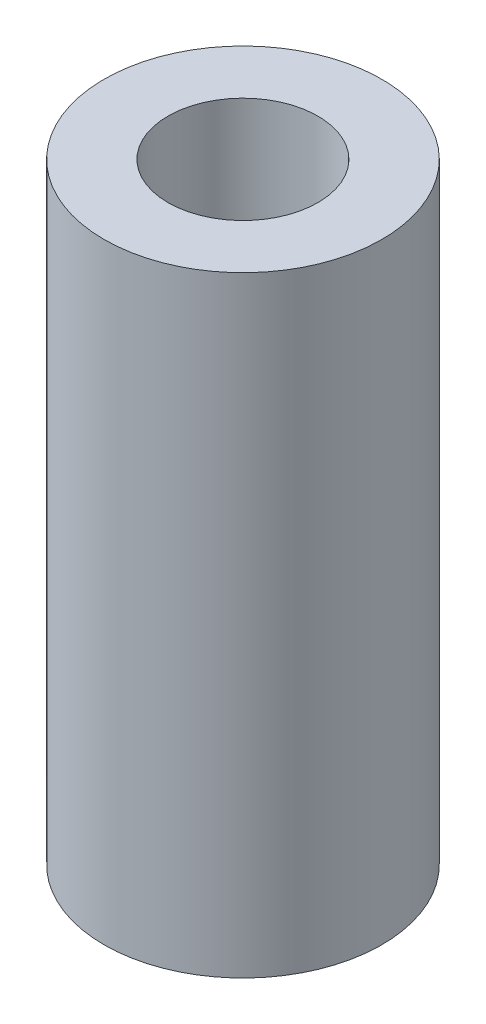
ISO-10303-21;
HEADER;
FILE_DESCRIPTION(('STEP AP214'),'2;1');
FILE_NAME('part.step','',(''),(''),'','','');
FILE_SCHEMA(('AUTOMOTIVE_DESIGN { 1 0 10303 214 1 1 1 1 }'));
ENDSEC;
DATA;
#1=APPLICATION_CONTEXT('core data for automotive mechanical design processes');
#2=APPLICATION_PROTOCOL_DEFINITION('international standard','automotive_design',2000,#1);
#3=PRODUCT_CONTEXT('',#1,'mechanical');
#4=PRODUCT('Part','Part','',(#3));
#5=PRODUCT_RELATED_PRODUCT_CATEGORY('part','',(#4));
#6=PRODUCT_DEFINITION_FORMATION('','',#4);
#7=PRODUCT_DEFINITION_CONTEXT('part definition',#1,'design');
#8=PRODUCT_DEFINITION('design','',#6,#7);
#9=PRODUCT_DEFINITION_SHAPE('','',#8);
#10=(LENGTH_UNIT() NAMED_UNIT(*) SI_UNIT(.MILLI.,.METRE.));
#11=(NAMED_UNIT(*) PLANE_ANGLE_UNIT() SI_UNIT($,.RADIAN.));
#12=(NAMED_UNIT(*) SI_UNIT($,.STERADIAN.) SOLID_ANGLE_UNIT());
#13=UNCERTAINTY_MEASURE_WITH_UNIT(LENGTH_MEASURE(1.E-05),#10,'distance_accuracy_value','');
#14=(GEOMETRIC_REPRESENTATION_CONTEXT(3) GLOBAL_UNCERTAINTY_ASSIGNED_CONTEXT((#13)) GLOBAL_UNIT_ASSIGNED_CONTEXT((#10,
#11,#12)) REPRESENTATION_CONTEXT('',''));
#15=CARTESIAN_POINT('',(0.,0.,0.));
#16=DIRECTION('',(0.,0.,1.));
#17=DIRECTION('',(1.,0.,0.));
#18=AXIS2_PLACEMENT_3D('',#15,#16,#17);
#19=CARTESIAN_POINT('',(0.,11.,0.));
#20=DIRECTION('',(0.,1.,0.));
#21=DIRECTION('',(0.,0.,1.));
#22=AXIS2_PLACEMENT_3D('',#19,#20,#21);
#23=PLANE('',#22);
#24=CARTESIAN_POINT('',(0.,11.,0.));
#25=DIRECTION('',(0.,1.,0.));
#26=DIRECTION('',(0.,0.,1.));
#27=AXIS2_PLACEMENT_3D('',#24,#25,#26);
#28=CIRCLE('',#27,2.5);
#29=CARTESIAN_POINT('',(0.,11.,2.5));
#30=VERTEX_POINT('',#29);
#31=EDGE_CURVE('E10',#30,#30,#28,.T.);
#32=ORIENTED_EDGE('',*,*,#31,.T.);
#33=EDGE_LOOP('',(#32));
#34=FACE_BOUND('',#33,.T.);
#35=CARTESIAN_POINT('',(0.,11.,0.));
#36=DIRECTION('',(0.,1.,0.));
#37=DIRECTION('',(0.,0.,1.));
#38=AXIS2_PLACEMENT_3D('',#35,#36,#37);
#39=CIRCLE('',#38,1.35);
#40=CARTESIAN_POINT('',(0.,11.,1.35));
#41=VERTEX_POINT('',#40);
#42=EDGE_CURVE('E43',#41,#41,#39,.T.);
#43=ORIENTED_EDGE('',*,*,#42,.F.);
#44=EDGE_LOOP('',(#43));
#45=FACE_BOUND('',#44,.T.);
#46=ADVANCED_FACE('F32',(#34,#45),#23,.T.);
#47=CARTESIAN_POINT('',(0.,0.,0.));
#48=DIRECTION('',(0.,1.,0.));
#49=DIRECTION('',(0.,0.,1.));
#50=AXIS2_PLACEMENT_3D('',#47,#48,#49);
#51=PLANE('',#50);
#52=CARTESIAN_POINT('',(0.,0.,0.));
#53=DIRECTION('',(0.,1.,0.));
#54=DIRECTION('',(0.,0.,1.));
#55=AXIS2_PLACEMENT_3D('',#52,#53,#54);
#56=CIRCLE('',#55,2.5);
#57=CARTESIAN_POINT('',(0.,0.,2.5));
#58=VERTEX_POINT('',#57);
#59=EDGE_CURVE('E36',#58,#58,#56,.T.);
#60=ORIENTED_EDGE('',*,*,#59,.F.);
#61=EDGE_LOOP('',(#60));
#62=FACE_BOUND('',#61,.T.);
#63=CARTESIAN_POINT('',(0.,0.,0.));
#64=DIRECTION('',(0.,1.,0.));
#65=DIRECTION('',(0.,0.,1.));
#66=AXIS2_PLACEMENT_3D('',#63,#64,#65);
#67=CIRCLE('',#66,1.35);
#68=CARTESIAN_POINT('',(0.,0.,1.35));
#69=VERTEX_POINT('',#68);
#70=EDGE_CURVE('E45',#69,#69,#67,.T.);
#71=ORIENTED_EDGE('',*,*,#70,.T.);
#72=EDGE_LOOP('',(#71));
#73=FACE_BOUND('',#72,.T.);
#74=ADVANCED_FACE('F55',(#62,#73),#51,.F.);
#75=CARTESIAN_POINT('',(0.,11.,0.));
#76=DIRECTION('',(0.,-1.,0.));
#77=DIRECTION('',(0.,0.,-1.));
#78=AXIS2_PLACEMENT_3D('',#75,#76,#77);
#79=CYLINDRICAL_SURFACE('',#78,2.5);
#80=ORIENTED_EDGE('',*,*,#31,.F.);
#81=EDGE_LOOP('',(#80));
#82=FACE_BOUND('',#81,.T.);
#83=ORIENTED_EDGE('',*,*,#59,.T.);
#84=EDGE_LOOP('',(#83));
#85=FACE_BOUND('',#84,.T.);
#86=ADVANCED_FACE('F34',(#82,#85),#79,.T.);
#87=CARTESIAN_POINT('',(0.,11.,0.));
#88=DIRECTION('',(0.,-1.,0.));
#89=DIRECTION('',(0.,0.,-1.));
#90=AXIS2_PLACEMENT_3D('',#87,#88,#89);
#91=CYLINDRICAL_SURFACE('',#90,1.35);
#92=ORIENTED_EDGE('',*,*,#42,.T.);
#93=EDGE_LOOP('',(#92));
#94=FACE_BOUND('',#93,.T.);
#95=ORIENTED_EDGE('',*,*,#70,.F.);
#96=EDGE_LOOP('',(#95));
#97=FACE_BOUND('',#96,.T.);
#98=ADVANCED_FACE('F51',(#94,#97),#91,.F.);
#99=CLOSED_SHELL('',(#46,#74,#86,#98));
#100=MANIFOLD_SOLID_BREP('B2',#99);
#101=ADVANCED_BREP_SHAPE_REPRESENTATION('',(#18,#100),#14);
#102=SHAPE_DEFINITION_REPRESENTATION(#9,#101);
ENDSEC;
END-ISO-10303-21;
